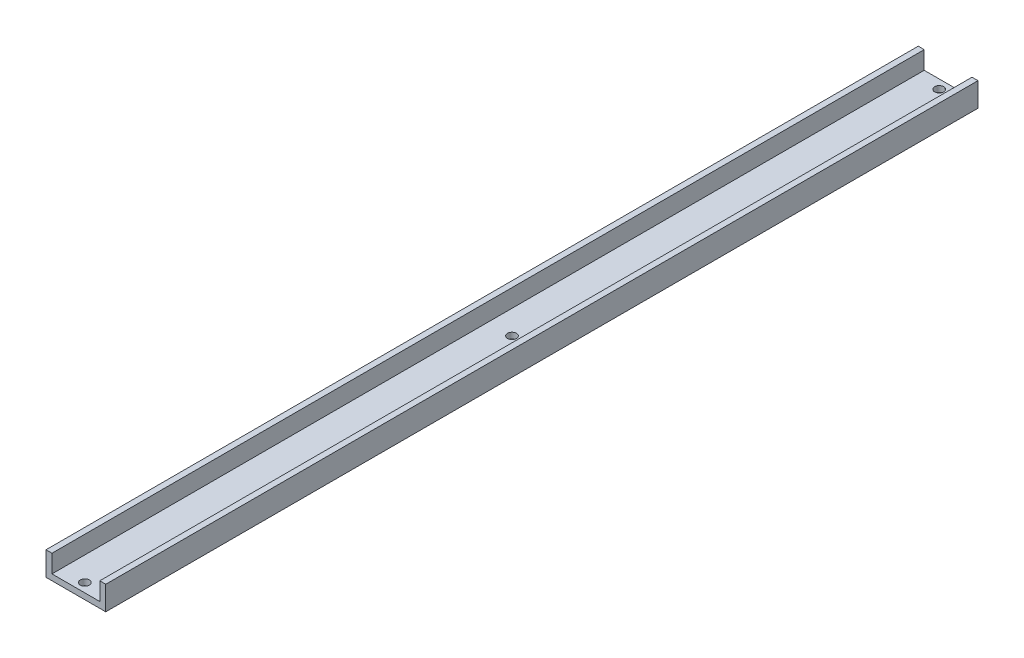
ISO-10303-21;
HEADER;
FILE_DESCRIPTION(('STEP AP214'),'2;1');
FILE_NAME('part.step','',(''),(''),'','','');
FILE_SCHEMA(('AUTOMOTIVE_DESIGN { 1 0 10303 214 1 1 1 1 }'));
ENDSEC;
DATA;
#1=APPLICATION_CONTEXT('core data for automotive mechanical design processes');
#2=APPLICATION_PROTOCOL_DEFINITION('international standard','automotive_design',2000,#1);
#3=PRODUCT_CONTEXT('',#1,'mechanical');
#4=PRODUCT('Part','Part','',(#3));
#5=PRODUCT_RELATED_PRODUCT_CATEGORY('part','',(#4));
#6=PRODUCT_DEFINITION_FORMATION('','',#4);
#7=PRODUCT_DEFINITION_CONTEXT('part definition',#1,'design');
#8=PRODUCT_DEFINITION('design','',#6,#7);
#9=PRODUCT_DEFINITION_SHAPE('','',#8);
#10=(LENGTH_UNIT() NAMED_UNIT(*) SI_UNIT(.MILLI.,.METRE.));
#11=(NAMED_UNIT(*) PLANE_ANGLE_UNIT() SI_UNIT($,.RADIAN.));
#12=(NAMED_UNIT(*) SI_UNIT($,.STERADIAN.) SOLID_ANGLE_UNIT());
#13=UNCERTAINTY_MEASURE_WITH_UNIT(LENGTH_MEASURE(1.E-05),#10,'distance_accuracy_value','');
#14=(GEOMETRIC_REPRESENTATION_CONTEXT(3) GLOBAL_UNCERTAINTY_ASSIGNED_CONTEXT((#13)) GLOBAL_UNIT_ASSIGNED_CONTEXT((#10,
#11,#12)) REPRESENTATION_CONTEXT('',''));
#15=CARTESIAN_POINT('',(0.,0.,0.));
#16=DIRECTION('',(0.,0.,1.));
#17=DIRECTION('',(1.,0.,0.));
#18=AXIS2_PLACEMENT_3D('',#15,#16,#17);
#19=CARTESIAN_POINT('',(0.,0.,463.55));
#20=DIRECTION('',(1.,0.,0.));
#21=DIRECTION('',(0.,0.,-1.));
#22=AXIS2_PLACEMENT_3D('',#19,#20,#21);
#23=PLANE('',#22);
#24=DIRECTION('',(0.,-1.,0.));
#25=VECTOR('',#24,1.);
#26=CARTESIAN_POINT('',(0.,0.,0.));
#27=LINE('',#26,#25);
#28=CARTESIAN_POINT('',(0.,12.7,0.));
#29=VERTEX_POINT('',#28);
#30=CARTESIAN_POINT('',(0.,0.,0.));
#31=VERTEX_POINT('',#30);
#32=EDGE_CURVE('E134',#29,#31,#27,.T.);
#33=ORIENTED_EDGE('',*,*,#32,.T.);
#34=DIRECTION('',(0.,0.,-1.));
#35=VECTOR('',#34,1.);
#36=CARTESIAN_POINT('',(0.,0.,463.55));
#37=LINE('',#36,#35);
#38=CARTESIAN_POINT('',(0.,0.,463.55));
#39=VERTEX_POINT('',#38);
#40=EDGE_CURVE('E11',#39,#31,#37,.T.);
#41=ORIENTED_EDGE('',*,*,#40,.F.);
#42=DIRECTION('',(0.,-1.,0.));
#43=VECTOR('',#42,1.);
#44=CARTESIAN_POINT('',(0.,0.,463.55));
#45=LINE('',#44,#43);
#46=CARTESIAN_POINT('',(0.,12.7,463.55));
#47=VERTEX_POINT('',#46);
#48=EDGE_CURVE('E149',#47,#39,#45,.T.);
#49=ORIENTED_EDGE('',*,*,#48,.F.);
#50=DIRECTION('',(0.,0.,-1.));
#51=VECTOR('',#50,1.);
#52=CARTESIAN_POINT('',(0.,12.7,463.55));
#53=LINE('',#52,#51);
#54=EDGE_CURVE('E130',#47,#29,#53,.T.);
#55=ORIENTED_EDGE('',*,*,#54,.T.);
#56=EDGE_LOOP('',(#33,#41,#49,#55));
#57=FACE_BOUND('',#56,.T.);
#58=ADVANCED_FACE('F38',(#57),#23,.F.);
#59=CARTESIAN_POINT('',(0.,0.,463.55));
#60=DIRECTION('',(0.,1.,0.));
#61=DIRECTION('',(0.,0.,1.));
#62=AXIS2_PLACEMENT_3D('',#59,#60,#61);
#63=PLANE('',#62);
#64=CARTESIAN_POINT('',(15.875,0.,231.775));
#65=DIRECTION('',(0.,1.,0.));
#66=DIRECTION('',(0.,0.,1.));
#67=AXIS2_PLACEMENT_3D('',#64,#65,#66);
#68=CIRCLE('',#67,2.413);
#69=CARTESIAN_POINT('',(15.875,0.,234.188));
#70=VERTEX_POINT('',#69);
#71=EDGE_CURVE('E189',#70,#70,#68,.F.);
#72=ORIENTED_EDGE('',*,*,#71,.F.);
#73=EDGE_LOOP('',(#72));
#74=FACE_BOUND('',#73,.T.);
#75=CARTESIAN_POINT('',(15.875,0.,458.7875));
#76=DIRECTION('',(0.,1.,0.));
#77=DIRECTION('',(0.,0.,1.));
#78=AXIS2_PLACEMENT_3D('',#75,#76,#77);
#79=CIRCLE('',#78,2.41300000000002);
#80=CARTESIAN_POINT('',(15.875,0.,461.2005));
#81=VERTEX_POINT('',#80);
#82=EDGE_CURVE('E138',#81,#81,#79,.F.);
#83=ORIENTED_EDGE('',*,*,#82,.F.);
#84=EDGE_LOOP('',(#83));
#85=FACE_BOUND('',#84,.T.);
#86=CARTESIAN_POINT('',(15.875,0.,4.7625));
#87=DIRECTION('',(0.,1.,0.));
#88=DIRECTION('',(0.,0.,1.));
#89=AXIS2_PLACEMENT_3D('',#86,#87,#88);
#90=CIRCLE('',#89,2.413);
#91=CARTESIAN_POINT('',(15.875,0.,7.1755));
#92=VERTEX_POINT('',#91);
#93=EDGE_CURVE('E182',#92,#92,#90,.F.);
#94=ORIENTED_EDGE('',*,*,#93,.F.);
#95=EDGE_LOOP('',(#94));
#96=FACE_BOUND('',#95,.T.);
#97=DIRECTION('',(1.,0.,0.));
#98=VECTOR('',#97,1.);
#99=CARTESIAN_POINT('',(0.,0.,0.));
#100=LINE('',#99,#98);
#101=CARTESIAN_POINT('',(31.75,0.,0.));
#102=VERTEX_POINT('',#101);
#103=EDGE_CURVE('E137',#31,#102,#100,.T.);
#104=ORIENTED_EDGE('',*,*,#103,.T.);
#105=DIRECTION('',(0.,0.,-1.));
#106=VECTOR('',#105,1.);
#107=CARTESIAN_POINT('',(31.75,0.,463.55));
#108=LINE('',#107,#106);
#109=CARTESIAN_POINT('',(31.75,0.,463.55));
#110=VERTEX_POINT('',#109);
#111=EDGE_CURVE('E46',#110,#102,#108,.T.);
#112=ORIENTED_EDGE('',*,*,#111,.F.);
#113=DIRECTION('',(1.,0.,0.));
#114=VECTOR('',#113,1.);
#115=CARTESIAN_POINT('',(0.,0.,463.55));
#116=LINE('',#115,#114);
#117=EDGE_CURVE('E97',#39,#110,#116,.T.);
#118=ORIENTED_EDGE('',*,*,#117,.F.);
#119=ORIENTED_EDGE('',*,*,#40,.T.);
#120=EDGE_LOOP('',(#104,#112,#118,#119));
#121=FACE_BOUND('',#120,.T.);
#122=ADVANCED_FACE('F217',(#74,#85,#96,#121),#63,.F.);
#123=CARTESIAN_POINT('',(31.75,0.,463.55));
#124=DIRECTION('',(-1.,0.,0.));
#125=DIRECTION('',(0.,0.,1.));
#126=AXIS2_PLACEMENT_3D('',#123,#124,#125);
#127=PLANE('',#126);
#128=DIRECTION('',(0.,1.,0.));
#129=VECTOR('',#128,1.);
#130=CARTESIAN_POINT('',(31.75,0.,0.));
#131=LINE('',#130,#129);
#132=CARTESIAN_POINT('',(31.75,12.7,0.));
#133=VERTEX_POINT('',#132);
#134=EDGE_CURVE('E140',#102,#133,#131,.T.);
#135=ORIENTED_EDGE('',*,*,#134,.T.);
#136=DIRECTION('',(0.,0.,-1.));
#137=VECTOR('',#136,1.);
#138=CARTESIAN_POINT('',(31.75,12.7,463.55));
#139=LINE('',#138,#137);
#140=CARTESIAN_POINT('',(31.75,12.7,463.55));
#141=VERTEX_POINT('',#140);
#142=EDGE_CURVE('E156',#141,#133,#139,.T.);
#143=ORIENTED_EDGE('',*,*,#142,.F.);
#144=DIRECTION('',(0.,1.,0.));
#145=VECTOR('',#144,1.);
#146=CARTESIAN_POINT('',(31.75,0.,463.55));
#147=LINE('',#146,#145);
#148=EDGE_CURVE('E164',#110,#141,#147,.T.);
#149=ORIENTED_EDGE('',*,*,#148,.F.);
#150=ORIENTED_EDGE('',*,*,#111,.T.);
#151=EDGE_LOOP('',(#135,#143,#149,#150));
#152=FACE_BOUND('',#151,.T.);
#153=ADVANCED_FACE('F162',(#152),#127,.F.);
#154=CARTESIAN_POINT('',(31.75,12.7,463.55));
#155=DIRECTION('',(0.,-1.,0.));
#156=DIRECTION('',(0.,0.,-1.));
#157=AXIS2_PLACEMENT_3D('',#154,#155,#156);
#158=PLANE('',#157);
#159=DIRECTION('',(-1.,0.,0.));
#160=VECTOR('',#159,1.);
#161=CARTESIAN_POINT('',(31.75,12.7,0.));
#162=LINE('',#161,#160);
#163=CARTESIAN_POINT('',(28.575,12.7,0.));
#164=VERTEX_POINT('',#163);
#165=EDGE_CURVE('E142',#133,#164,#162,.T.);
#166=ORIENTED_EDGE('',*,*,#165,.T.);
#167=DIRECTION('',(0.,0.,-1.));
#168=VECTOR('',#167,1.);
#169=CARTESIAN_POINT('',(28.575,12.7,463.55));
#170=LINE('',#169,#168);
#171=CARTESIAN_POINT('',(28.575,12.7,463.55));
#172=VERTEX_POINT('',#171);
#173=EDGE_CURVE('E153',#172,#164,#170,.T.);
#174=ORIENTED_EDGE('',*,*,#173,.F.);
#175=DIRECTION('',(-1.,0.,0.));
#176=VECTOR('',#175,1.);
#177=CARTESIAN_POINT('',(31.75,12.7,463.55));
#178=LINE('',#177,#176);
#179=EDGE_CURVE('E176',#141,#172,#178,.T.);
#180=ORIENTED_EDGE('',*,*,#179,.F.);
#181=ORIENTED_EDGE('',*,*,#142,.T.);
#182=EDGE_LOOP('',(#166,#174,#180,#181));
#183=FACE_BOUND('',#182,.T.);
#184=ADVANCED_FACE('F172',(#183),#158,.F.);
#185=CARTESIAN_POINT('',(28.575,3.175,463.55));
#186=DIRECTION('',(1.,0.,0.));
#187=DIRECTION('',(0.,0.,-1.));
#188=AXIS2_PLACEMENT_3D('',#185,#186,#187);
#189=PLANE('',#188);
#190=DIRECTION('',(0.,-1.,0.));
#191=VECTOR('',#190,1.);
#192=CARTESIAN_POINT('',(28.575,3.175,0.));
#193=LINE('',#192,#191);
#194=CARTESIAN_POINT('',(28.575,3.175,0.));
#195=VERTEX_POINT('',#194);
#196=EDGE_CURVE('E144',#164,#195,#193,.T.);
#197=ORIENTED_EDGE('',*,*,#196,.T.);
#198=DIRECTION('',(0.,0.,-1.));
#199=VECTOR('',#198,1.);
#200=CARTESIAN_POINT('',(28.575,3.175,463.55));
#201=LINE('',#200,#199);
#202=CARTESIAN_POINT('',(28.575,3.175,463.55));
#203=VERTEX_POINT('',#202);
#204=EDGE_CURVE('E125',#203,#195,#201,.T.);
#205=ORIENTED_EDGE('',*,*,#204,.F.);
#206=DIRECTION('',(0.,-1.,0.));
#207=VECTOR('',#206,1.);
#208=CARTESIAN_POINT('',(28.575,3.175,463.55));
#209=LINE('',#208,#207);
#210=EDGE_CURVE('E116',#172,#203,#209,.T.);
#211=ORIENTED_EDGE('',*,*,#210,.F.);
#212=ORIENTED_EDGE('',*,*,#173,.T.);
#213=EDGE_LOOP('',(#197,#205,#211,#212));
#214=FACE_BOUND('',#213,.T.);
#215=ADVANCED_FACE('F175',(#214),#189,.F.);
#216=CARTESIAN_POINT('',(3.175,3.175,463.55));
#217=DIRECTION('',(0.,-1.,0.));
#218=DIRECTION('',(0.,0.,-1.));
#219=AXIS2_PLACEMENT_3D('',#216,#217,#218);
#220=PLANE('',#219);
#221=CARTESIAN_POINT('',(15.875,3.175,231.775));
#222=DIRECTION('',(0.,1.,0.));
#223=DIRECTION('',(0.,0.,1.));
#224=AXIS2_PLACEMENT_3D('',#221,#222,#223);
#225=CIRCLE('',#224,2.413);
#226=CARTESIAN_POINT('',(15.875,3.175,234.188));
#227=VERTEX_POINT('',#226);
#228=EDGE_CURVE('E196',#227,#227,#225,.T.);
#229=ORIENTED_EDGE('',*,*,#228,.F.);
#230=EDGE_LOOP('',(#229));
#231=FACE_BOUND('',#230,.T.);
#232=CARTESIAN_POINT('',(15.875,3.175,458.7875));
#233=DIRECTION('',(0.,1.,0.));
#234=DIRECTION('',(0.,0.,1.));
#235=AXIS2_PLACEMENT_3D('',#232,#233,#234);
#236=CIRCLE('',#235,2.41300000000002);
#237=CARTESIAN_POINT('',(15.875,3.175,461.2005));
#238=VERTEX_POINT('',#237);
#239=EDGE_CURVE('E185',#238,#238,#236,.T.);
#240=ORIENTED_EDGE('',*,*,#239,.F.);
#241=EDGE_LOOP('',(#240));
#242=FACE_BOUND('',#241,.T.);
#243=CARTESIAN_POINT('',(15.875,3.175,4.7625));
#244=DIRECTION('',(0.,1.,0.));
#245=DIRECTION('',(0.,0.,1.));
#246=AXIS2_PLACEMENT_3D('',#243,#244,#245);
#247=CIRCLE('',#246,2.413);
#248=CARTESIAN_POINT('',(15.875,3.175,7.1755));
#249=VERTEX_POINT('',#248);
#250=EDGE_CURVE('E186',#249,#249,#247,.T.);
#251=ORIENTED_EDGE('',*,*,#250,.F.);
#252=EDGE_LOOP('',(#251));
#253=FACE_BOUND('',#252,.T.);
#254=DIRECTION('',(-1.,0.,0.));
#255=VECTOR('',#254,1.);
#256=CARTESIAN_POINT('',(3.175,3.175,0.));
#257=LINE('',#256,#255);
#258=CARTESIAN_POINT('',(3.175,3.175,0.));
#259=VERTEX_POINT('',#258);
#260=EDGE_CURVE('E124',#195,#259,#257,.T.);
#261=ORIENTED_EDGE('',*,*,#260,.T.);
#262=DIRECTION('',(0.,0.,-1.));
#263=VECTOR('',#262,1.);
#264=CARTESIAN_POINT('',(3.175,3.175,463.55));
#265=LINE('',#264,#263);
#266=CARTESIAN_POINT('',(3.175,3.175,463.55));
#267=VERTEX_POINT('',#266);
#268=EDGE_CURVE('E121',#267,#259,#265,.T.);
#269=ORIENTED_EDGE('',*,*,#268,.F.);
#270=DIRECTION('',(-1.,0.,0.));
#271=VECTOR('',#270,1.);
#272=CARTESIAN_POINT('',(3.175,3.175,463.55));
#273=LINE('',#272,#271);
#274=EDGE_CURVE('E110',#203,#267,#273,.T.);
#275=ORIENTED_EDGE('',*,*,#274,.F.);
#276=ORIENTED_EDGE('',*,*,#204,.T.);
#277=EDGE_LOOP('',(#261,#269,#275,#276));
#278=FACE_BOUND('',#277,.T.);
#279=ADVANCED_FACE('F122',(#231,#242,#253,#278),#220,.F.);
#280=CARTESIAN_POINT('',(3.175,3.175,463.55));
#281=DIRECTION('',(-1.,0.,0.));
#282=DIRECTION('',(0.,0.,1.));
#283=AXIS2_PLACEMENT_3D('',#280,#281,#282);
#284=PLANE('',#283);
#285=DIRECTION('',(0.,1.,0.));
#286=VECTOR('',#285,1.);
#287=CARTESIAN_POINT('',(3.175,3.175,0.));
#288=LINE('',#287,#286);
#289=CARTESIAN_POINT('',(3.175,12.7,0.));
#290=VERTEX_POINT('',#289);
#291=EDGE_CURVE('E83',#259,#290,#288,.T.);
#292=ORIENTED_EDGE('',*,*,#291,.T.);
#293=DIRECTION('',(0.,0.,-1.));
#294=VECTOR('',#293,1.);
#295=CARTESIAN_POINT('',(3.175,12.7,463.55));
#296=LINE('',#295,#294);
#297=CARTESIAN_POINT('',(3.175,12.7,463.55));
#298=VERTEX_POINT('',#297);
#299=EDGE_CURVE('E126',#298,#290,#296,.T.);
#300=ORIENTED_EDGE('',*,*,#299,.F.);
#301=DIRECTION('',(0.,1.,0.));
#302=VECTOR('',#301,1.);
#303=CARTESIAN_POINT('',(3.175,3.175,463.55));
#304=LINE('',#303,#302);
#305=EDGE_CURVE('E114',#267,#298,#304,.T.);
#306=ORIENTED_EDGE('',*,*,#305,.F.);
#307=ORIENTED_EDGE('',*,*,#268,.T.);
#308=EDGE_LOOP('',(#292,#300,#306,#307));
#309=FACE_BOUND('',#308,.T.);
#310=ADVANCED_FACE('F128',(#309),#284,.F.);
#311=CARTESIAN_POINT('',(0.,12.7,463.55));
#312=DIRECTION('',(0.,-1.,0.));
#313=DIRECTION('',(0.,0.,-1.));
#314=AXIS2_PLACEMENT_3D('',#311,#312,#313);
#315=PLANE('',#314);
#316=DIRECTION('',(-1.,0.,0.));
#317=VECTOR('',#316,1.);
#318=CARTESIAN_POINT('',(0.,12.7,0.));
#319=LINE('',#318,#317);
#320=EDGE_CURVE('E89',#290,#29,#319,.T.);
#321=ORIENTED_EDGE('',*,*,#320,.T.);
#322=ORIENTED_EDGE('',*,*,#54,.F.);
#323=DIRECTION('',(-1.,0.,0.));
#324=VECTOR('',#323,1.);
#325=CARTESIAN_POINT('',(0.,12.7,463.55));
#326=LINE('',#325,#324);
#327=EDGE_CURVE('E54',#298,#47,#326,.T.);
#328=ORIENTED_EDGE('',*,*,#327,.F.);
#329=ORIENTED_EDGE('',*,*,#299,.T.);
#330=EDGE_LOOP('',(#321,#322,#328,#329));
#331=FACE_BOUND('',#330,.T.);
#332=ADVANCED_FACE('F223',(#331),#315,.F.);
#333=CARTESIAN_POINT('',(0.,0.,463.55));
#334=DIRECTION('',(0.,0.,-1.));
#335=DIRECTION('',(-1.,0.,0.));
#336=AXIS2_PLACEMENT_3D('',#333,#334,#335);
#337=PLANE('',#336);
#338=ORIENTED_EDGE('',*,*,#48,.T.);
#339=ORIENTED_EDGE('',*,*,#117,.T.);
#340=ORIENTED_EDGE('',*,*,#148,.T.);
#341=ORIENTED_EDGE('',*,*,#179,.T.);
#342=ORIENTED_EDGE('',*,*,#210,.T.);
#343=ORIENTED_EDGE('',*,*,#274,.T.);
#344=ORIENTED_EDGE('',*,*,#305,.T.);
#345=ORIENTED_EDGE('',*,*,#327,.T.);
#346=EDGE_LOOP('',(#338,#339,#340,#341,#342,#343,#344,#345));
#347=FACE_BOUND('',#346,.T.);
#348=ADVANCED_FACE('F112',(#347),#337,.F.);
#349=CARTESIAN_POINT('',(0.,0.,0.));
#350=DIRECTION('',(0.,0.,-1.));
#351=DIRECTION('',(-1.,0.,0.));
#352=AXIS2_PLACEMENT_3D('',#349,#350,#351);
#353=PLANE('',#352);
#354=ORIENTED_EDGE('',*,*,#32,.F.);
#355=ORIENTED_EDGE('',*,*,#320,.F.);
#356=ORIENTED_EDGE('',*,*,#291,.F.);
#357=ORIENTED_EDGE('',*,*,#260,.F.);
#358=ORIENTED_EDGE('',*,*,#196,.F.);
#359=ORIENTED_EDGE('',*,*,#165,.F.);
#360=ORIENTED_EDGE('',*,*,#134,.F.);
#361=ORIENTED_EDGE('',*,*,#103,.F.);
#362=EDGE_LOOP('',(#354,#355,#356,#357,#358,#359,#360,#361));
#363=FACE_BOUND('',#362,.T.);
#364=ADVANCED_FACE('F168',(#363),#353,.T.);
#365=CARTESIAN_POINT('',(15.875,-0.00100000000000013,4.7625));
#366=DIRECTION('',(0.,1.,0.));
#367=DIRECTION('',(0.,0.,1.));
#368=AXIS2_PLACEMENT_3D('',#365,#366,#367);
#369=CYLINDRICAL_SURFACE('',#368,2.413);
#370=ORIENTED_EDGE('',*,*,#250,.T.);
#371=EDGE_LOOP('',(#370));
#372=FACE_BOUND('',#371,.T.);
#373=ORIENTED_EDGE('',*,*,#93,.T.);
#374=EDGE_LOOP('',(#373));
#375=FACE_BOUND('',#374,.T.);
#376=ADVANCED_FACE('F210',(#372,#375),#369,.F.);
#377=CARTESIAN_POINT('',(15.875,-0.00100000000000013,458.7875));
#378=DIRECTION('',(0.,1.,0.));
#379=DIRECTION('',(0.,0.,1.));
#380=AXIS2_PLACEMENT_3D('',#377,#378,#379);
#381=CYLINDRICAL_SURFACE('',#380,2.41300000000002);
#382=ORIENTED_EDGE('',*,*,#239,.T.);
#383=EDGE_LOOP('',(#382));
#384=FACE_BOUND('',#383,.T.);
#385=ORIENTED_EDGE('',*,*,#82,.T.);
#386=EDGE_LOOP('',(#385));
#387=FACE_BOUND('',#386,.T.);
#388=ADVANCED_FACE('F213',(#384,#387),#381,.F.);
#389=CARTESIAN_POINT('',(15.875,-0.00100000000000013,231.775));
#390=DIRECTION('',(0.,1.,0.));
#391=DIRECTION('',(0.,0.,1.));
#392=AXIS2_PLACEMENT_3D('',#389,#390,#391);
#393=CYLINDRICAL_SURFACE('',#392,2.413);
#394=ORIENTED_EDGE('',*,*,#228,.T.);
#395=EDGE_LOOP('',(#394));
#396=FACE_BOUND('',#395,.T.);
#397=ORIENTED_EDGE('',*,*,#71,.T.);
#398=EDGE_LOOP('',(#397));
#399=FACE_BOUND('',#398,.T.);
#400=ADVANCED_FACE('F200',(#396,#399),#393,.F.);
#401=CLOSED_SHELL('',(#58,#122,#153,#184,#215,#279,#310,#332,#348,#364,#376,#388,#400));
#402=MANIFOLD_SOLID_BREP('B2',#401);
#403=ADVANCED_BREP_SHAPE_REPRESENTATION('',(#18,#402),#14);
#404=SHAPE_DEFINITION_REPRESENTATION(#9,#403);
ENDSEC;
END-ISO-10303-21;
